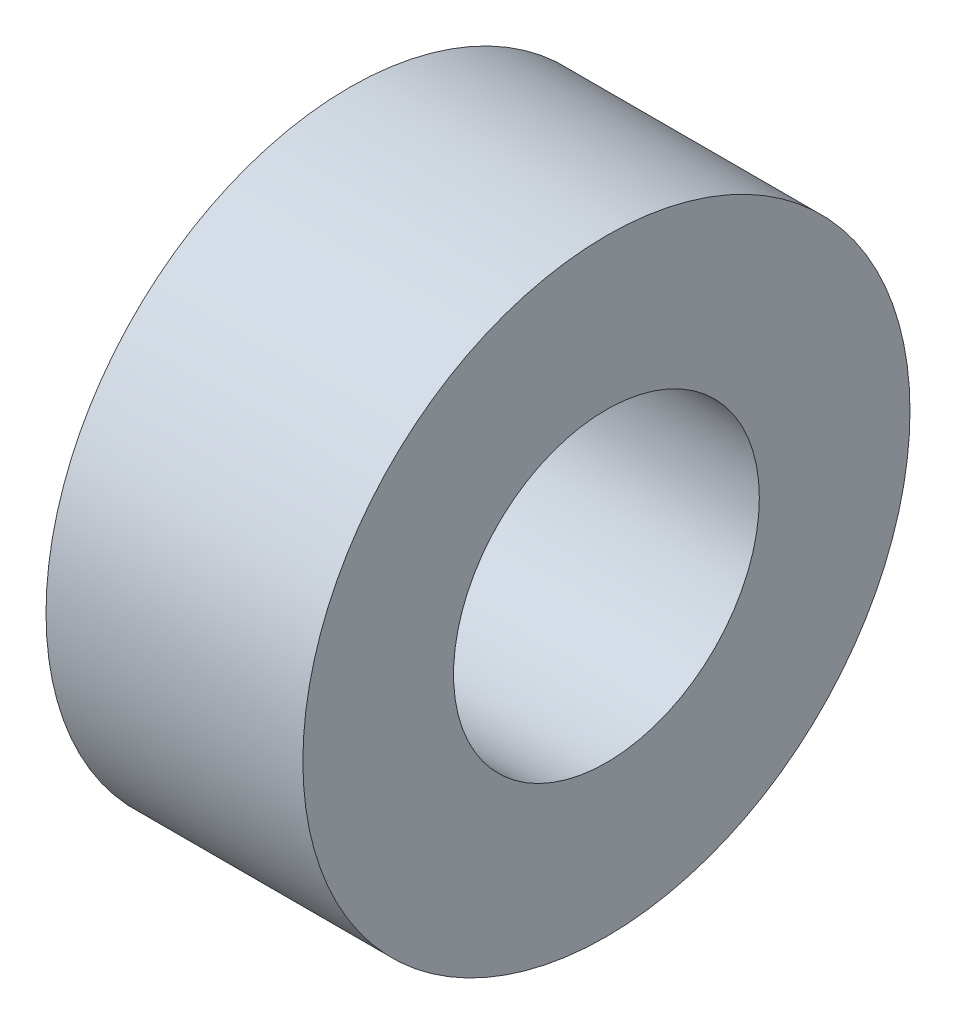
ISO-10303-21;
HEADER;
FILE_DESCRIPTION(('STEP AP214'),'2;1');
FILE_NAME('part.step','',(''),(''),'','','');
FILE_SCHEMA(('AUTOMOTIVE_DESIGN { 1 0 10303 214 1 1 1 1 }'));
ENDSEC;
DATA;
#1=APPLICATION_CONTEXT('core data for automotive mechanical design processes');
#2=APPLICATION_PROTOCOL_DEFINITION('international standard','automotive_design',2000,#1);
#3=PRODUCT_CONTEXT('',#1,'mechanical');
#4=PRODUCT('Part','Part','',(#3));
#5=PRODUCT_RELATED_PRODUCT_CATEGORY('part','',(#4));
#6=PRODUCT_DEFINITION_FORMATION('','',#4);
#7=PRODUCT_DEFINITION_CONTEXT('part definition',#1,'design');
#8=PRODUCT_DEFINITION('design','',#6,#7);
#9=PRODUCT_DEFINITION_SHAPE('','',#8);
#10=(LENGTH_UNIT() NAMED_UNIT(*) SI_UNIT(.MILLI.,.METRE.));
#11=(NAMED_UNIT(*) PLANE_ANGLE_UNIT() SI_UNIT($,.RADIAN.));
#12=(NAMED_UNIT(*) SI_UNIT($,.STERADIAN.) SOLID_ANGLE_UNIT());
#13=UNCERTAINTY_MEASURE_WITH_UNIT(LENGTH_MEASURE(1.E-05),#10,'distance_accuracy_value','');
#14=(GEOMETRIC_REPRESENTATION_CONTEXT(3) GLOBAL_UNCERTAINTY_ASSIGNED_CONTEXT((#13)) GLOBAL_UNIT_ASSIGNED_CONTEXT((#10,
#11,#12)) REPRESENTATION_CONTEXT('',''));
#15=CARTESIAN_POINT('',(0.,0.,0.));
#16=DIRECTION('',(0.,0.,1.));
#17=DIRECTION('',(1.,0.,0.));
#18=AXIS2_PLACEMENT_3D('',#15,#16,#17);
#19=CARTESIAN_POINT('',(2.,0.,0.));
#20=DIRECTION('',(1.,0.,0.));
#21=DIRECTION('',(0.,0.,-1.));
#22=AXIS2_PLACEMENT_3D('',#19,#20,#21);
#23=PLANE('',#22);
#24=CARTESIAN_POINT('',(2.,0.,0.));
#25=DIRECTION('',(1.,0.,0.));
#26=DIRECTION('',(0.,0.,-1.));
#27=AXIS2_PLACEMENT_3D('',#24,#25,#26);
#28=CIRCLE('',#27,4.72715786839464);
#29=CARTESIAN_POINT('',(2.,0.,-4.72715786839464));
#30=VERTEX_POINT('',#29);
#31=EDGE_CURVE('E10',#30,#30,#28,.T.);
#32=ORIENTED_EDGE('',*,*,#31,.T.);
#33=EDGE_LOOP('',(#32));
#34=FACE_BOUND('',#33,.T.);
#35=CARTESIAN_POINT('',(2.,0.,0.));
#36=DIRECTION('',(1.,0.,0.));
#37=DIRECTION('',(0.,0.,-1.));
#38=AXIS2_PLACEMENT_3D('',#35,#36,#37);
#39=CIRCLE('',#38,2.38125);
#40=CARTESIAN_POINT('',(2.,0.,-2.38125));
#41=VERTEX_POINT('',#40);
#42=EDGE_CURVE('E42',#41,#41,#39,.T.);
#43=ORIENTED_EDGE('',*,*,#42,.F.);
#44=EDGE_LOOP('',(#43));
#45=FACE_BOUND('',#44,.T.);
#46=ADVANCED_FACE('F31',(#34,#45),#23,.T.);
#47=CARTESIAN_POINT('',(-2.,0.,0.));
#48=DIRECTION('',(1.,0.,0.));
#49=DIRECTION('',(0.,0.,-1.));
#50=AXIS2_PLACEMENT_3D('',#47,#48,#49);
#51=PLANE('',#50);
#52=CARTESIAN_POINT('',(-2.,0.,0.));
#53=DIRECTION('',(1.,0.,0.));
#54=DIRECTION('',(0.,0.,-1.));
#55=AXIS2_PLACEMENT_3D('',#52,#53,#54);
#56=CIRCLE('',#55,4.72715786839464);
#57=CARTESIAN_POINT('',(-2.,0.,-4.72715786839464));
#58=VERTEX_POINT('',#57);
#59=EDGE_CURVE('E35',#58,#58,#56,.T.);
#60=ORIENTED_EDGE('',*,*,#59,.F.);
#61=EDGE_LOOP('',(#60));
#62=FACE_BOUND('',#61,.T.);
#63=CARTESIAN_POINT('',(-2.,0.,0.));
#64=DIRECTION('',(1.,0.,0.));
#65=DIRECTION('',(0.,0.,-1.));
#66=AXIS2_PLACEMENT_3D('',#63,#64,#65);
#67=CIRCLE('',#66,2.38125);
#68=CARTESIAN_POINT('',(-2.,0.,-2.38125));
#69=VERTEX_POINT('',#68);
#70=EDGE_CURVE('E44',#69,#69,#67,.T.);
#71=ORIENTED_EDGE('',*,*,#70,.T.);
#72=EDGE_LOOP('',(#71));
#73=FACE_BOUND('',#72,.T.);
#74=ADVANCED_FACE('F54',(#62,#73),#51,.F.);
#75=CARTESIAN_POINT('',(2.,0.,0.));
#76=DIRECTION('',(-1.,0.,0.));
#77=DIRECTION('',(0.,0.,1.));
#78=AXIS2_PLACEMENT_3D('',#75,#76,#77);
#79=CYLINDRICAL_SURFACE('',#78,4.72715786839464);
#80=ORIENTED_EDGE('',*,*,#31,.F.);
#81=EDGE_LOOP('',(#80));
#82=FACE_BOUND('',#81,.T.);
#83=ORIENTED_EDGE('',*,*,#59,.T.);
#84=EDGE_LOOP('',(#83));
#85=FACE_BOUND('',#84,.T.);
#86=ADVANCED_FACE('F33',(#82,#85),#79,.T.);
#87=CARTESIAN_POINT('',(2.,0.,0.));
#88=DIRECTION('',(-1.,0.,0.));
#89=DIRECTION('',(0.,0.,1.));
#90=AXIS2_PLACEMENT_3D('',#87,#88,#89);
#91=CYLINDRICAL_SURFACE('',#90,2.38125);
#92=ORIENTED_EDGE('',*,*,#42,.T.);
#93=EDGE_LOOP('',(#92));
#94=FACE_BOUND('',#93,.T.);
#95=ORIENTED_EDGE('',*,*,#70,.F.);
#96=EDGE_LOOP('',(#95));
#97=FACE_BOUND('',#96,.T.);
#98=ADVANCED_FACE('F50',(#94,#97),#91,.F.);
#99=CLOSED_SHELL('',(#46,#74,#86,#98));
#100=MANIFOLD_SOLID_BREP('B2',#99);
#101=ADVANCED_BREP_SHAPE_REPRESENTATION('',(#18,#100),#14);
#102=SHAPE_DEFINITION_REPRESENTATION(#9,#101);
ENDSEC;
END-ISO-10303-21;
